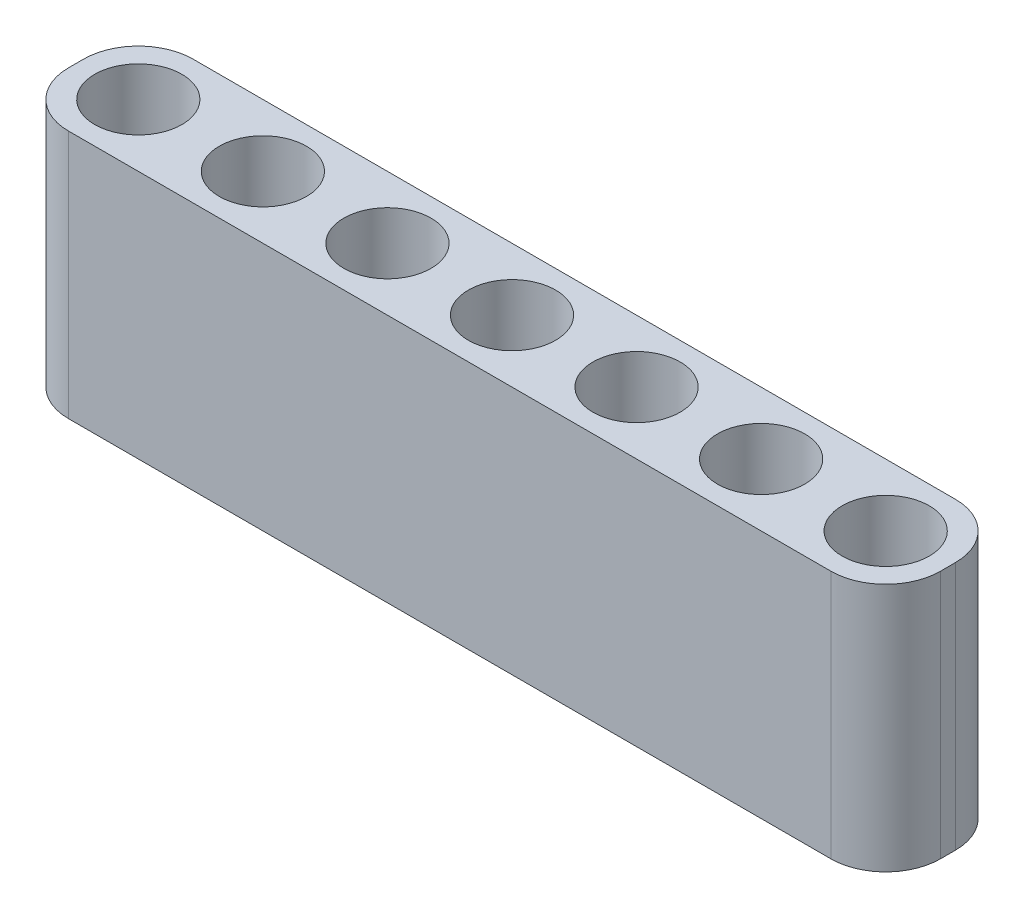
ISO-10303-21;
HEADER;
FILE_DESCRIPTION(('STEP AP214'),'2;1');
FILE_NAME('part.step','',(''),(''),'','','');
FILE_SCHEMA(('AUTOMOTIVE_DESIGN { 1 0 10303 214 1 1 1 1 }'));
ENDSEC;
DATA;
#1=APPLICATION_CONTEXT('core data for automotive mechanical design processes');
#2=APPLICATION_PROTOCOL_DEFINITION('international standard','automotive_design',2000,#1);
#3=PRODUCT_CONTEXT('',#1,'mechanical');
#4=PRODUCT('Part','Part','',(#3));
#5=PRODUCT_RELATED_PRODUCT_CATEGORY('part','',(#4));
#6=PRODUCT_DEFINITION_FORMATION('','',#4);
#7=PRODUCT_DEFINITION_CONTEXT('part definition',#1,'design');
#8=PRODUCT_DEFINITION('design','',#6,#7);
#9=PRODUCT_DEFINITION_SHAPE('','',#8);
#10=(LENGTH_UNIT() NAMED_UNIT(*) SI_UNIT(.MILLI.,.METRE.));
#11=(NAMED_UNIT(*) PLANE_ANGLE_UNIT() SI_UNIT($,.RADIAN.));
#12=(NAMED_UNIT(*) SI_UNIT($,.STERADIAN.) SOLID_ANGLE_UNIT());
#13=UNCERTAINTY_MEASURE_WITH_UNIT(LENGTH_MEASURE(1.E-05),#10,'distance_accuracy_value','');
#14=(GEOMETRIC_REPRESENTATION_CONTEXT(3) GLOBAL_UNCERTAINTY_ASSIGNED_CONTEXT((#13)) GLOBAL_UNIT_ASSIGNED_CONTEXT((#10,
#11,#12)) REPRESENTATION_CONTEXT('',''));
#15=CARTESIAN_POINT('',(0.,0.,0.));
#16=DIRECTION('',(0.,0.,1.));
#17=DIRECTION('',(1.,0.,0.));
#18=AXIS2_PLACEMENT_3D('',#15,#16,#17);
#19=CARTESIAN_POINT('',(32.8,10.,-2.8));
#20=DIRECTION('',(0.,-1.,0.));
#21=DIRECTION('',(0.,0.,-1.));
#22=AXIS2_PLACEMENT_3D('',#19,#20,#21);
#23=PLANE('',#22);
#24=CARTESIAN_POINT('',(32.8,10.,-2.8));
#25=DIRECTION('',(0.,1.,0.));
#26=DIRECTION('',(0.,0.,-1.));
#27=AXIS2_PLACEMENT_3D('',#24,#25,#26);
#28=CIRCLE('',#27,2.2);
#29=CARTESIAN_POINT('',(35.,10.,-2.79999999999998));
#30=VERTEX_POINT('',#29);
#31=CARTESIAN_POINT('',(32.8,10.,-5.));
#32=VERTEX_POINT('',#31);
#33=EDGE_CURVE('E170',#30,#32,#28,.T.);
#34=ORIENTED_EDGE('',*,*,#33,.T.);
#35=DIRECTION('',(-1.,0.,0.));
#36=VECTOR('',#35,1.);
#37=CARTESIAN_POINT('',(2.20000000000002,10.,-5.));
#38=LINE('',#37,#36);
#39=CARTESIAN_POINT('',(2.20000000000002,10.,-5.));
#40=VERTEX_POINT('',#39);
#41=EDGE_CURVE('E106',#32,#40,#38,.T.);
#42=ORIENTED_EDGE('',*,*,#41,.T.);
#43=CARTESIAN_POINT('',(2.2,10.,-2.8));
#44=DIRECTION('',(0.,1.,0.));
#45=DIRECTION('',(0.,0.,-1.));
#46=AXIS2_PLACEMENT_3D('',#43,#44,#45);
#47=CIRCLE('',#46,2.2);
#48=CARTESIAN_POINT('',(0.,10.,-2.79999999999998));
#49=VERTEX_POINT('',#48);
#50=EDGE_CURVE('E191',#40,#49,#47,.T.);
#51=ORIENTED_EDGE('',*,*,#50,.T.);
#52=DIRECTION('',(0.,0.,1.));
#53=VECTOR('',#52,1.);
#54=CARTESIAN_POINT('',(0.,10.,-2.20000000000002));
#55=LINE('',#54,#53);
#56=CARTESIAN_POINT('',(0.,10.,-2.20000000000002));
#57=VERTEX_POINT('',#56);
#58=EDGE_CURVE('E205',#49,#57,#55,.T.);
#59=ORIENTED_EDGE('',*,*,#58,.T.);
#60=CARTESIAN_POINT('',(2.2,10.,-2.2));
#61=DIRECTION('',(0.,1.,0.));
#62=DIRECTION('',(0.,0.,-1.));
#63=AXIS2_PLACEMENT_3D('',#60,#61,#62);
#64=CIRCLE('',#63,2.2);
#65=CARTESIAN_POINT('',(2.20000000000002,10.,0.));
#66=VERTEX_POINT('',#65);
#67=EDGE_CURVE('E125',#57,#66,#64,.T.);
#68=ORIENTED_EDGE('',*,*,#67,.T.);
#69=DIRECTION('',(1.,0.,0.));
#70=VECTOR('',#69,1.);
#71=CARTESIAN_POINT('',(2.20000000000002,10.,0.));
#72=LINE('',#71,#70);
#73=CARTESIAN_POINT('',(32.8,10.,0.));
#74=VERTEX_POINT('',#73);
#75=EDGE_CURVE('E119',#66,#74,#72,.T.);
#76=ORIENTED_EDGE('',*,*,#75,.T.);
#77=CARTESIAN_POINT('',(32.8,10.,-2.2));
#78=DIRECTION('',(0.,1.,0.));
#79=DIRECTION('',(0.,0.,1.));
#80=AXIS2_PLACEMENT_3D('',#77,#78,#79);
#81=CIRCLE('',#80,2.2);
#82=CARTESIAN_POINT('',(35.,10.,-2.20000000000002));
#83=VERTEX_POINT('',#82);
#84=EDGE_CURVE('E123',#74,#83,#81,.T.);
#85=ORIENTED_EDGE('',*,*,#84,.T.);
#86=DIRECTION('',(0.,0.,-1.));
#87=VECTOR('',#86,1.);
#88=CARTESIAN_POINT('',(35.,10.,-2.20000000000002));
#89=LINE('',#88,#87);
#90=EDGE_CURVE('E63',#83,#30,#89,.T.);
#91=ORIENTED_EDGE('',*,*,#90,.T.);
#92=EDGE_LOOP('',(#34,#42,#51,#59,#68,#76,#85,#91));
#93=FACE_BOUND('',#92,.T.);
#94=CARTESIAN_POINT('',(2.5,10.,-2.5));
#95=DIRECTION('',(0.,1.,0.));
#96=DIRECTION('',(0.,0.,1.));
#97=AXIS2_PLACEMENT_3D('',#94,#95,#96);
#98=CIRCLE('',#97,1.75);
#99=CARTESIAN_POINT('',(2.5,10.,-0.75));
#100=VERTEX_POINT('',#99);
#101=EDGE_CURVE('E152',#100,#100,#98,.T.);
#102=ORIENTED_EDGE('',*,*,#101,.F.);
#103=EDGE_LOOP('',(#102));
#104=FACE_BOUND('',#103,.T.);
#105=CARTESIAN_POINT('',(7.5,10.,-2.5));
#106=DIRECTION('',(0.,1.,0.));
#107=DIRECTION('',(0.,0.,1.));
#108=AXIS2_PLACEMENT_3D('',#105,#106,#107);
#109=CIRCLE('',#108,1.75);
#110=CARTESIAN_POINT('',(7.5,10.,-0.75));
#111=VERTEX_POINT('',#110);
#112=EDGE_CURVE('E219',#111,#111,#109,.T.);
#113=ORIENTED_EDGE('',*,*,#112,.F.);
#114=EDGE_LOOP('',(#113));
#115=FACE_BOUND('',#114,.T.);
#116=CARTESIAN_POINT('',(12.5,10.,-2.5));
#117=DIRECTION('',(0.,1.,0.));
#118=DIRECTION('',(0.,0.,1.));
#119=AXIS2_PLACEMENT_3D('',#116,#117,#118);
#120=CIRCLE('',#119,1.75);
#121=CARTESIAN_POINT('',(12.5,10.,-0.75));
#122=VERTEX_POINT('',#121);
#123=EDGE_CURVE('E227',#122,#122,#120,.T.);
#124=ORIENTED_EDGE('',*,*,#123,.F.);
#125=EDGE_LOOP('',(#124));
#126=FACE_BOUND('',#125,.T.);
#127=CARTESIAN_POINT('',(17.5,10.,-2.5));
#128=DIRECTION('',(0.,1.,0.));
#129=DIRECTION('',(0.,0.,1.));
#130=AXIS2_PLACEMENT_3D('',#127,#128,#129);
#131=CIRCLE('',#130,1.75);
#132=CARTESIAN_POINT('',(17.5,10.,-0.75));
#133=VERTEX_POINT('',#132);
#134=EDGE_CURVE('E235',#133,#133,#131,.T.);
#135=ORIENTED_EDGE('',*,*,#134,.F.);
#136=EDGE_LOOP('',(#135));
#137=FACE_BOUND('',#136,.T.);
#138=CARTESIAN_POINT('',(22.5,10.,-2.5));
#139=DIRECTION('',(0.,1.,0.));
#140=DIRECTION('',(0.,0.,1.));
#141=AXIS2_PLACEMENT_3D('',#138,#139,#140);
#142=CIRCLE('',#141,1.75);
#143=CARTESIAN_POINT('',(22.5,10.,-0.749999999999997));
#144=VERTEX_POINT('',#143);
#145=EDGE_CURVE('E243',#144,#144,#142,.T.);
#146=ORIENTED_EDGE('',*,*,#145,.F.);
#147=EDGE_LOOP('',(#146));
#148=FACE_BOUND('',#147,.T.);
#149=CARTESIAN_POINT('',(27.5,10.,-2.5));
#150=DIRECTION('',(0.,1.,0.));
#151=DIRECTION('',(0.,0.,1.));
#152=AXIS2_PLACEMENT_3D('',#149,#150,#151);
#153=CIRCLE('',#152,1.75);
#154=CARTESIAN_POINT('',(27.5,10.,-0.75));
#155=VERTEX_POINT('',#154);
#156=EDGE_CURVE('E251',#155,#155,#153,.T.);
#157=ORIENTED_EDGE('',*,*,#156,.F.);
#158=EDGE_LOOP('',(#157));
#159=FACE_BOUND('',#158,.T.);
#160=CARTESIAN_POINT('',(32.5,10.,-2.5));
#161=DIRECTION('',(0.,1.,0.));
#162=DIRECTION('',(0.,0.,1.));
#163=AXIS2_PLACEMENT_3D('',#160,#161,#162);
#164=CIRCLE('',#163,1.75);
#165=CARTESIAN_POINT('',(32.5,10.,-0.750000000000003));
#166=VERTEX_POINT('',#165);
#167=EDGE_CURVE('E259',#166,#166,#164,.T.);
#168=ORIENTED_EDGE('',*,*,#167,.F.);
#169=EDGE_LOOP('',(#168));
#170=FACE_BOUND('',#169,.T.);
#171=ADVANCED_FACE('F45',(#93,#104,#115,#126,#137,#148,#159,#170),#23,.F.);
#172=CARTESIAN_POINT('',(32.8,0.,-2.8));
#173=DIRECTION('',(0.,-1.,0.));
#174=DIRECTION('',(0.,0.,-1.));
#175=AXIS2_PLACEMENT_3D('',#172,#173,#174);
#176=PLANE('',#175);
#177=CARTESIAN_POINT('',(27.5,0.,-2.5));
#178=DIRECTION('',(0.,1.,0.));
#179=DIRECTION('',(0.,0.,1.));
#180=AXIS2_PLACEMENT_3D('',#177,#178,#179);
#181=CIRCLE('',#180,1.75);
#182=CARTESIAN_POINT('',(27.5,0.,-0.75));
#183=VERTEX_POINT('',#182);
#184=EDGE_CURVE('E255',#183,#183,#181,.T.);
#185=ORIENTED_EDGE('',*,*,#184,.T.);
#186=EDGE_LOOP('',(#185));
#187=FACE_BOUND('',#186,.T.);
#188=CARTESIAN_POINT('',(17.5,0.,-2.5));
#189=DIRECTION('',(0.,1.,0.));
#190=DIRECTION('',(0.,0.,1.));
#191=AXIS2_PLACEMENT_3D('',#188,#189,#190);
#192=CIRCLE('',#191,1.75);
#193=CARTESIAN_POINT('',(17.5,0.,-0.75));
#194=VERTEX_POINT('',#193);
#195=EDGE_CURVE('E239',#194,#194,#192,.T.);
#196=ORIENTED_EDGE('',*,*,#195,.T.);
#197=EDGE_LOOP('',(#196));
#198=FACE_BOUND('',#197,.T.);
#199=CARTESIAN_POINT('',(7.5,0.,-2.5));
#200=DIRECTION('',(0.,1.,0.));
#201=DIRECTION('',(0.,0.,1.));
#202=AXIS2_PLACEMENT_3D('',#199,#200,#201);
#203=CIRCLE('',#202,1.75);
#204=CARTESIAN_POINT('',(7.5,0.,-0.75));
#205=VERTEX_POINT('',#204);
#206=EDGE_CURVE('E223',#205,#205,#203,.T.);
#207=ORIENTED_EDGE('',*,*,#206,.T.);
#208=EDGE_LOOP('',(#207));
#209=FACE_BOUND('',#208,.T.);
#210=CARTESIAN_POINT('',(32.8,0.,-2.8));
#211=DIRECTION('',(0.,1.,0.));
#212=DIRECTION('',(0.,0.,-1.));
#213=AXIS2_PLACEMENT_3D('',#210,#211,#212);
#214=CIRCLE('',#213,2.2);
#215=CARTESIAN_POINT('',(35.,0.,-2.79999999999998));
#216=VERTEX_POINT('',#215);
#217=CARTESIAN_POINT('',(32.8,0.,-5.));
#218=VERTEX_POINT('',#217);
#219=EDGE_CURVE('E147',#216,#218,#214,.T.);
#220=ORIENTED_EDGE('',*,*,#219,.F.);
#221=DIRECTION('',(0.,0.,-1.));
#222=VECTOR('',#221,1.);
#223=CARTESIAN_POINT('',(35.,0.,-2.20000000000002));
#224=LINE('',#223,#222);
#225=CARTESIAN_POINT('',(35.,0.,-2.20000000000002));
#226=VERTEX_POINT('',#225);
#227=EDGE_CURVE('E98',#226,#216,#224,.T.);
#228=ORIENTED_EDGE('',*,*,#227,.F.);
#229=CARTESIAN_POINT('',(32.8,0.,-2.2));
#230=DIRECTION('',(0.,1.,0.));
#231=DIRECTION('',(0.,0.,1.));
#232=AXIS2_PLACEMENT_3D('',#229,#230,#231);
#233=CIRCLE('',#232,2.2);
#234=CARTESIAN_POINT('',(32.8,0.,0.));
#235=VERTEX_POINT('',#234);
#236=EDGE_CURVE('E92',#235,#226,#233,.T.);
#237=ORIENTED_EDGE('',*,*,#236,.F.);
#238=DIRECTION('',(1.,0.,0.));
#239=VECTOR('',#238,1.);
#240=CARTESIAN_POINT('',(2.20000000000002,0.,0.));
#241=LINE('',#240,#239);
#242=CARTESIAN_POINT('',(2.20000000000002,0.,0.));
#243=VERTEX_POINT('',#242);
#244=EDGE_CURVE('E134',#243,#235,#241,.T.);
#245=ORIENTED_EDGE('',*,*,#244,.F.);
#246=CARTESIAN_POINT('',(2.2,0.,-2.2));
#247=DIRECTION('',(0.,1.,0.));
#248=DIRECTION('',(0.,0.,-1.));
#249=AXIS2_PLACEMENT_3D('',#246,#247,#248);
#250=CIRCLE('',#249,2.2);
#251=CARTESIAN_POINT('',(0.,0.,-2.20000000000002));
#252=VERTEX_POINT('',#251);
#253=EDGE_CURVE('E161',#252,#243,#250,.T.);
#254=ORIENTED_EDGE('',*,*,#253,.F.);
#255=DIRECTION('',(0.,0.,1.));
#256=VECTOR('',#255,1.);
#257=CARTESIAN_POINT('',(0.,0.,-2.20000000000002));
#258=LINE('',#257,#256);
#259=CARTESIAN_POINT('',(0.,0.,-2.79999999999998));
#260=VERTEX_POINT('',#259);
#261=EDGE_CURVE('E158',#260,#252,#258,.T.);
#262=ORIENTED_EDGE('',*,*,#261,.F.);
#263=CARTESIAN_POINT('',(2.2,0.,-2.8));
#264=DIRECTION('',(0.,1.,0.));
#265=DIRECTION('',(0.,0.,-1.));
#266=AXIS2_PLACEMENT_3D('',#263,#264,#265);
#267=CIRCLE('',#266,2.2);
#268=CARTESIAN_POINT('',(2.20000000000002,0.,-5.));
#269=VERTEX_POINT('',#268);
#270=EDGE_CURVE('E155',#269,#260,#267,.T.);
#271=ORIENTED_EDGE('',*,*,#270,.F.);
#272=DIRECTION('',(-1.,0.,0.));
#273=VECTOR('',#272,1.);
#274=CARTESIAN_POINT('',(2.20000000000002,0.,-5.));
#275=LINE('',#274,#273);
#276=EDGE_CURVE('E151',#218,#269,#275,.T.);
#277=ORIENTED_EDGE('',*,*,#276,.F.);
#278=EDGE_LOOP('',(#220,#228,#237,#245,#254,#262,#271,#277));
#279=FACE_BOUND('',#278,.T.);
#280=CARTESIAN_POINT('',(2.5,0.,-2.5));
#281=DIRECTION('',(0.,1.,0.));
#282=DIRECTION('',(0.,0.,1.));
#283=AXIS2_PLACEMENT_3D('',#280,#281,#282);
#284=CIRCLE('',#283,1.75);
#285=CARTESIAN_POINT('',(2.5,0.,-0.75));
#286=VERTEX_POINT('',#285);
#287=EDGE_CURVE('E215',#286,#286,#284,.T.);
#288=ORIENTED_EDGE('',*,*,#287,.T.);
#289=EDGE_LOOP('',(#288));
#290=FACE_BOUND('',#289,.T.);
#291=CARTESIAN_POINT('',(12.5,0.,-2.5));
#292=DIRECTION('',(0.,1.,0.));
#293=DIRECTION('',(0.,0.,1.));
#294=AXIS2_PLACEMENT_3D('',#291,#292,#293);
#295=CIRCLE('',#294,1.75);
#296=CARTESIAN_POINT('',(12.5,0.,-0.75));
#297=VERTEX_POINT('',#296);
#298=EDGE_CURVE('E231',#297,#297,#295,.T.);
#299=ORIENTED_EDGE('',*,*,#298,.T.);
#300=EDGE_LOOP('',(#299));
#301=FACE_BOUND('',#300,.T.);
#302=CARTESIAN_POINT('',(22.5,0.,-2.5));
#303=DIRECTION('',(0.,1.,0.));
#304=DIRECTION('',(0.,0.,1.));
#305=AXIS2_PLACEMENT_3D('',#302,#303,#304);
#306=CIRCLE('',#305,1.75);
#307=CARTESIAN_POINT('',(22.5,0.,-0.749999999999997));
#308=VERTEX_POINT('',#307);
#309=EDGE_CURVE('E247',#308,#308,#306,.T.);
#310=ORIENTED_EDGE('',*,*,#309,.T.);
#311=EDGE_LOOP('',(#310));
#312=FACE_BOUND('',#311,.T.);
#313=CARTESIAN_POINT('',(32.5,0.,-2.5));
#314=DIRECTION('',(0.,1.,0.));
#315=DIRECTION('',(0.,0.,1.));
#316=AXIS2_PLACEMENT_3D('',#313,#314,#315);
#317=CIRCLE('',#316,1.75);
#318=CARTESIAN_POINT('',(32.5,0.,-0.750000000000003));
#319=VERTEX_POINT('',#318);
#320=EDGE_CURVE('E263',#319,#319,#317,.T.);
#321=ORIENTED_EDGE('',*,*,#320,.T.);
#322=EDGE_LOOP('',(#321));
#323=FACE_BOUND('',#322,.T.);
#324=ADVANCED_FACE('F195',(#187,#198,#209,#279,#290,#301,#312,#323),#176,.T.);
#325=CARTESIAN_POINT('',(32.8,10.,-2.8));
#326=DIRECTION('',(0.,-1.,0.));
#327=DIRECTION('',(0.,0.,-1.));
#328=AXIS2_PLACEMENT_3D('',#325,#326,#327);
#329=CYLINDRICAL_SURFACE('',#328,2.2);
#330=ORIENTED_EDGE('',*,*,#219,.T.);
#331=DIRECTION('',(0.,-1.,0.));
#332=VECTOR('',#331,1.);
#333=CARTESIAN_POINT('',(32.8,10.,-5.));
#334=LINE('',#333,#332);
#335=EDGE_CURVE('E11',#32,#218,#334,.T.);
#336=ORIENTED_EDGE('',*,*,#335,.F.);
#337=ORIENTED_EDGE('',*,*,#33,.F.);
#338=DIRECTION('',(0.,-1.,0.));
#339=VECTOR('',#338,1.);
#340=CARTESIAN_POINT('',(35.,10.,-2.79999999999998));
#341=LINE('',#340,#339);
#342=EDGE_CURVE('E143',#30,#216,#341,.T.);
#343=ORIENTED_EDGE('',*,*,#342,.T.);
#344=EDGE_LOOP('',(#330,#336,#337,#343));
#345=FACE_BOUND('',#344,.T.);
#346=ADVANCED_FACE('F47',(#345),#329,.T.);
#347=CARTESIAN_POINT('',(2.20000000000002,10.,-5.));
#348=DIRECTION('',(0.,0.,1.));
#349=DIRECTION('',(1.,0.,0.));
#350=AXIS2_PLACEMENT_3D('',#347,#348,#349);
#351=PLANE('',#350);
#352=ORIENTED_EDGE('',*,*,#276,.T.);
#353=DIRECTION('',(0.,-1.,0.));
#354=VECTOR('',#353,1.);
#355=CARTESIAN_POINT('',(2.20000000000002,10.,-5.));
#356=LINE('',#355,#354);
#357=EDGE_CURVE('E55',#40,#269,#356,.T.);
#358=ORIENTED_EDGE('',*,*,#357,.F.);
#359=ORIENTED_EDGE('',*,*,#41,.F.);
#360=ORIENTED_EDGE('',*,*,#335,.T.);
#361=EDGE_LOOP('',(#352,#358,#359,#360));
#362=FACE_BOUND('',#361,.T.);
#363=ADVANCED_FACE('F297',(#362),#351,.F.);
#364=CARTESIAN_POINT('',(2.2,10.,-2.8));
#365=DIRECTION('',(0.,-1.,0.));
#366=DIRECTION('',(0.,0.,-1.));
#367=AXIS2_PLACEMENT_3D('',#364,#365,#366);
#368=CYLINDRICAL_SURFACE('',#367,2.2);
#369=ORIENTED_EDGE('',*,*,#270,.T.);
#370=DIRECTION('',(0.,-1.,0.));
#371=VECTOR('',#370,1.);
#372=CARTESIAN_POINT('',(0.,10.,-2.79999999999998));
#373=LINE('',#372,#371);
#374=EDGE_CURVE('E181',#49,#260,#373,.T.);
#375=ORIENTED_EDGE('',*,*,#374,.F.);
#376=ORIENTED_EDGE('',*,*,#50,.F.);
#377=ORIENTED_EDGE('',*,*,#357,.T.);
#378=EDGE_LOOP('',(#369,#375,#376,#377));
#379=FACE_BOUND('',#378,.T.);
#380=ADVANCED_FACE('F189',(#379),#368,.T.);
#381=CARTESIAN_POINT('',(0.,10.,-2.20000000000002));
#382=DIRECTION('',(1.,0.,0.));
#383=DIRECTION('',(0.,0.,-1.));
#384=AXIS2_PLACEMENT_3D('',#381,#382,#383);
#385=PLANE('',#384);
#386=ORIENTED_EDGE('',*,*,#261,.T.);
#387=DIRECTION('',(0.,-1.,0.));
#388=VECTOR('',#387,1.);
#389=CARTESIAN_POINT('',(0.,10.,-2.20000000000002));
#390=LINE('',#389,#388);
#391=EDGE_CURVE('E177',#57,#252,#390,.T.);
#392=ORIENTED_EDGE('',*,*,#391,.F.);
#393=ORIENTED_EDGE('',*,*,#58,.F.);
#394=ORIENTED_EDGE('',*,*,#374,.T.);
#395=EDGE_LOOP('',(#386,#392,#393,#394));
#396=FACE_BOUND('',#395,.T.);
#397=ADVANCED_FACE('F200',(#396),#385,.F.);
#398=CARTESIAN_POINT('',(2.2,10.,-2.2));
#399=DIRECTION('',(0.,-1.,0.));
#400=DIRECTION('',(0.,0.,-1.));
#401=AXIS2_PLACEMENT_3D('',#398,#399,#400);
#402=CYLINDRICAL_SURFACE('',#401,2.2);
#403=ORIENTED_EDGE('',*,*,#253,.T.);
#404=DIRECTION('',(0.,-1.,0.));
#405=VECTOR('',#404,1.);
#406=CARTESIAN_POINT('',(2.20000000000002,10.,0.));
#407=LINE('',#406,#405);
#408=EDGE_CURVE('E136',#66,#243,#407,.T.);
#409=ORIENTED_EDGE('',*,*,#408,.F.);
#410=ORIENTED_EDGE('',*,*,#67,.F.);
#411=ORIENTED_EDGE('',*,*,#391,.T.);
#412=EDGE_LOOP('',(#403,#409,#410,#411));
#413=FACE_BOUND('',#412,.T.);
#414=ADVANCED_FACE('F203',(#413),#402,.T.);
#415=CARTESIAN_POINT('',(2.20000000000002,10.,0.));
#416=DIRECTION('',(0.,0.,-1.));
#417=DIRECTION('',(-1.,0.,0.));
#418=AXIS2_PLACEMENT_3D('',#415,#416,#417);
#419=PLANE('',#418);
#420=ORIENTED_EDGE('',*,*,#244,.T.);
#421=DIRECTION('',(0.,-1.,0.));
#422=VECTOR('',#421,1.);
#423=CARTESIAN_POINT('',(32.8,10.,0.));
#424=LINE('',#423,#422);
#425=EDGE_CURVE('E131',#74,#235,#424,.T.);
#426=ORIENTED_EDGE('',*,*,#425,.F.);
#427=ORIENTED_EDGE('',*,*,#75,.F.);
#428=ORIENTED_EDGE('',*,*,#408,.T.);
#429=EDGE_LOOP('',(#420,#426,#427,#428));
#430=FACE_BOUND('',#429,.T.);
#431=ADVANCED_FACE('F132',(#430),#419,.F.);
#432=CARTESIAN_POINT('',(32.8,10.,-2.2));
#433=DIRECTION('',(0.,-1.,0.));
#434=DIRECTION('',(0.,0.,-1.));
#435=AXIS2_PLACEMENT_3D('',#432,#433,#434);
#436=CYLINDRICAL_SURFACE('',#435,2.2);
#437=ORIENTED_EDGE('',*,*,#236,.T.);
#438=DIRECTION('',(0.,-1.,0.));
#439=VECTOR('',#438,1.);
#440=CARTESIAN_POINT('',(35.,10.,-2.20000000000002));
#441=LINE('',#440,#439);
#442=EDGE_CURVE('E137',#83,#226,#441,.T.);
#443=ORIENTED_EDGE('',*,*,#442,.F.);
#444=ORIENTED_EDGE('',*,*,#84,.F.);
#445=ORIENTED_EDGE('',*,*,#425,.T.);
#446=EDGE_LOOP('',(#437,#443,#444,#445));
#447=FACE_BOUND('',#446,.T.);
#448=ADVANCED_FACE('F139',(#447),#436,.T.);
#449=CARTESIAN_POINT('',(35.,10.,-2.20000000000002));
#450=DIRECTION('',(-1.,0.,0.));
#451=DIRECTION('',(0.,0.,1.));
#452=AXIS2_PLACEMENT_3D('',#449,#450,#451);
#453=PLANE('',#452);
#454=ORIENTED_EDGE('',*,*,#227,.T.);
#455=ORIENTED_EDGE('',*,*,#342,.F.);
#456=ORIENTED_EDGE('',*,*,#90,.F.);
#457=ORIENTED_EDGE('',*,*,#442,.T.);
#458=EDGE_LOOP('',(#454,#455,#456,#457));
#459=FACE_BOUND('',#458,.T.);
#460=ADVANCED_FACE('F285',(#459),#453,.F.);
#461=CARTESIAN_POINT('',(2.5,10.,-2.5));
#462=DIRECTION('',(0.,-1.,0.));
#463=DIRECTION('',(0.,0.,-1.));
#464=AXIS2_PLACEMENT_3D('',#461,#462,#463);
#465=CYLINDRICAL_SURFACE('',#464,1.75);
#466=ORIENTED_EDGE('',*,*,#101,.T.);
#467=EDGE_LOOP('',(#466));
#468=FACE_BOUND('',#467,.T.);
#469=ORIENTED_EDGE('',*,*,#287,.F.);
#470=EDGE_LOOP('',(#469));
#471=FACE_BOUND('',#470,.T.);
#472=ADVANCED_FACE('F282',(#468,#471),#465,.F.);
#473=CARTESIAN_POINT('',(7.5,10.,-2.5));
#474=DIRECTION('',(0.,-1.,0.));
#475=DIRECTION('',(0.,0.,-1.));
#476=AXIS2_PLACEMENT_3D('',#473,#474,#475);
#477=CYLINDRICAL_SURFACE('',#476,1.75);
#478=ORIENTED_EDGE('',*,*,#112,.T.);
#479=EDGE_LOOP('',(#478));
#480=FACE_BOUND('',#479,.T.);
#481=ORIENTED_EDGE('',*,*,#206,.F.);
#482=EDGE_LOOP('',(#481));
#483=FACE_BOUND('',#482,.T.);
#484=ADVANCED_FACE('F360',(#480,#483),#477,.F.);
#485=CARTESIAN_POINT('',(12.5,10.,-2.5));
#486=DIRECTION('',(0.,-1.,0.));
#487=DIRECTION('',(0.,0.,-1.));
#488=AXIS2_PLACEMENT_3D('',#485,#486,#487);
#489=CYLINDRICAL_SURFACE('',#488,1.75);
#490=ORIENTED_EDGE('',*,*,#123,.T.);
#491=EDGE_LOOP('',(#490));
#492=FACE_BOUND('',#491,.T.);
#493=ORIENTED_EDGE('',*,*,#298,.F.);
#494=EDGE_LOOP('',(#493));
#495=FACE_BOUND('',#494,.T.);
#496=ADVANCED_FACE('F368',(#492,#495),#489,.F.);
#497=CARTESIAN_POINT('',(17.5,10.,-2.5));
#498=DIRECTION('',(0.,-1.,0.));
#499=DIRECTION('',(0.,0.,-1.));
#500=AXIS2_PLACEMENT_3D('',#497,#498,#499);
#501=CYLINDRICAL_SURFACE('',#500,1.75);
#502=ORIENTED_EDGE('',*,*,#134,.T.);
#503=EDGE_LOOP('',(#502));
#504=FACE_BOUND('',#503,.T.);
#505=ORIENTED_EDGE('',*,*,#195,.F.);
#506=EDGE_LOOP('',(#505));
#507=FACE_BOUND('',#506,.T.);
#508=ADVANCED_FACE('F376',(#504,#507),#501,.F.);
#509=CARTESIAN_POINT('',(22.5,10.,-2.5));
#510=DIRECTION('',(0.,-1.,0.));
#511=DIRECTION('',(0.,0.,-1.));
#512=AXIS2_PLACEMENT_3D('',#509,#510,#511);
#513=CYLINDRICAL_SURFACE('',#512,1.75);
#514=ORIENTED_EDGE('',*,*,#145,.T.);
#515=EDGE_LOOP('',(#514));
#516=FACE_BOUND('',#515,.T.);
#517=ORIENTED_EDGE('',*,*,#309,.F.);
#518=EDGE_LOOP('',(#517));
#519=FACE_BOUND('',#518,.T.);
#520=ADVANCED_FACE('F385',(#516,#519),#513,.F.);
#521=CARTESIAN_POINT('',(27.5,10.,-2.5));
#522=DIRECTION('',(0.,-1.,0.));
#523=DIRECTION('',(0.,0.,-1.));
#524=AXIS2_PLACEMENT_3D('',#521,#522,#523);
#525=CYLINDRICAL_SURFACE('',#524,1.75);
#526=ORIENTED_EDGE('',*,*,#156,.T.);
#527=EDGE_LOOP('',(#526));
#528=FACE_BOUND('',#527,.T.);
#529=ORIENTED_EDGE('',*,*,#184,.F.);
#530=EDGE_LOOP('',(#529));
#531=FACE_BOUND('',#530,.T.);
#532=ADVANCED_FACE('F394',(#528,#531),#525,.F.);
#533=CARTESIAN_POINT('',(32.5,10.,-2.5));
#534=DIRECTION('',(0.,-1.,0.));
#535=DIRECTION('',(0.,0.,-1.));
#536=AXIS2_PLACEMENT_3D('',#533,#534,#535);
#537=CYLINDRICAL_SURFACE('',#536,1.75);
#538=ORIENTED_EDGE('',*,*,#167,.T.);
#539=EDGE_LOOP('',(#538));
#540=FACE_BOUND('',#539,.T.);
#541=ORIENTED_EDGE('',*,*,#320,.F.);
#542=EDGE_LOOP('',(#541));
#543=FACE_BOUND('',#542,.T.);
#544=ADVANCED_FACE('F271',(#540,#543),#537,.F.);
#545=CLOSED_SHELL('',(#171,#324,#346,#363,#380,#397,#414,#431,#448,#460,#472,#484,#496,#508,
#520,#532,#544));
#546=MANIFOLD_SOLID_BREP('B2',#545);
#547=ADVANCED_BREP_SHAPE_REPRESENTATION('',(#18,#546),#14);
#548=SHAPE_DEFINITION_REPRESENTATION(#9,#547);
ENDSEC;
END-ISO-10303-21;
